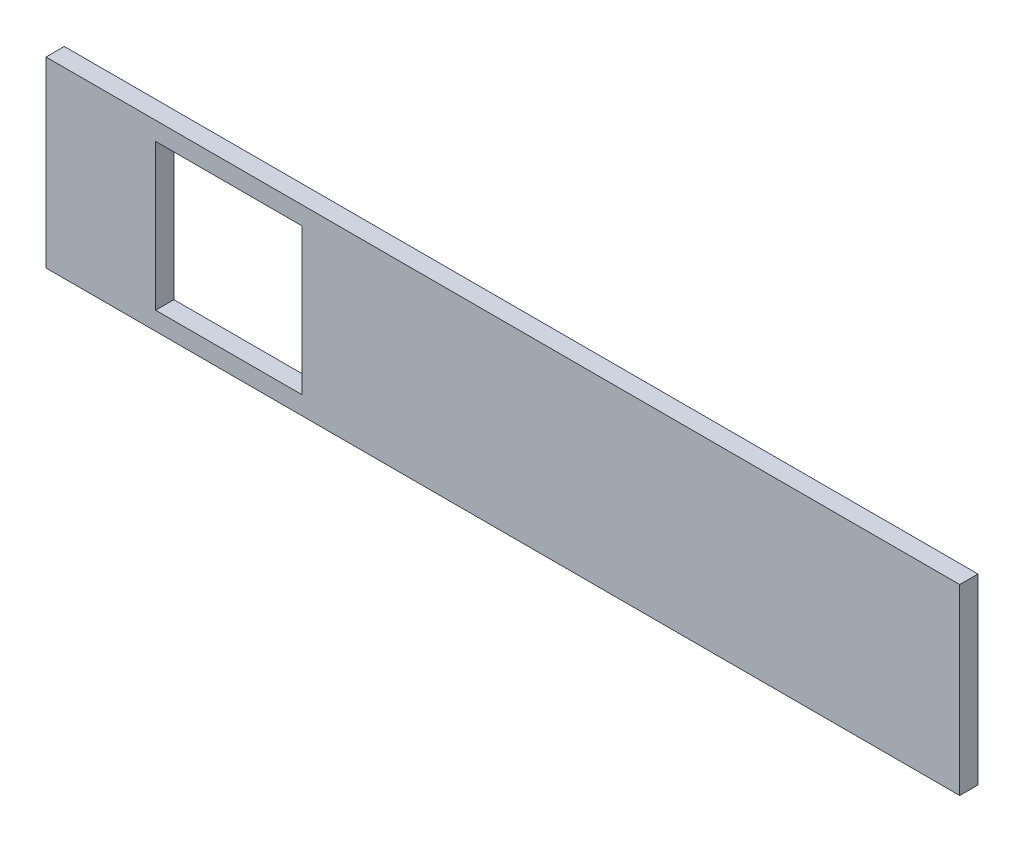
ISO-10303-21;
HEADER;
FILE_DESCRIPTION(('STEP AP214'),'2;1');
FILE_NAME('part.step','',(''),(''),'','','');
FILE_SCHEMA(('AUTOMOTIVE_DESIGN { 1 0 10303 214 1 1 1 1 }'));
ENDSEC;
DATA;
#1=APPLICATION_CONTEXT('core data for automotive mechanical design processes');
#2=APPLICATION_PROTOCOL_DEFINITION('international standard','automotive_design',2000,#1);
#3=PRODUCT_CONTEXT('',#1,'mechanical');
#4=PRODUCT('Part','Part','',(#3));
#5=PRODUCT_RELATED_PRODUCT_CATEGORY('part','',(#4));
#6=PRODUCT_DEFINITION_FORMATION('','',#4);
#7=PRODUCT_DEFINITION_CONTEXT('part definition',#1,'design');
#8=PRODUCT_DEFINITION('design','',#6,#7);
#9=PRODUCT_DEFINITION_SHAPE('','',#8);
#10=(LENGTH_UNIT() NAMED_UNIT(*) SI_UNIT(.MILLI.,.METRE.));
#11=(NAMED_UNIT(*) PLANE_ANGLE_UNIT() SI_UNIT($,.RADIAN.));
#12=(NAMED_UNIT(*) SI_UNIT($,.STERADIAN.) SOLID_ANGLE_UNIT());
#13=UNCERTAINTY_MEASURE_WITH_UNIT(LENGTH_MEASURE(1.E-05),#10,'distance_accuracy_value','');
#14=(GEOMETRIC_REPRESENTATION_CONTEXT(3) GLOBAL_UNCERTAINTY_ASSIGNED_CONTEXT((#13)) GLOBAL_UNIT_ASSIGNED_CONTEXT((#10,
#11,#12)) REPRESENTATION_CONTEXT('',''));
#15=CARTESIAN_POINT('',(0.,0.,0.));
#16=DIRECTION('',(0.,0.,1.));
#17=DIRECTION('',(1.,0.,0.));
#18=AXIS2_PLACEMENT_3D('',#15,#16,#17);
#19=CARTESIAN_POINT('',(0.,0.,10.));
#20=DIRECTION('',(0.,0.,1.));
#21=DIRECTION('',(1.,0.,0.));
#22=AXIS2_PLACEMENT_3D('',#19,#20,#21);
#23=PLANE('',#22);
#24=DIRECTION('',(0.,1.,0.));
#25=VECTOR('',#24,1.);
#26=CARTESIAN_POINT('',(0.,0.,10.));
#27=LINE('',#26,#25);
#28=CARTESIAN_POINT('',(0.,0.,10.));
#29=VERTEX_POINT('',#28);
#30=CARTESIAN_POINT('',(0.,100.,10.));
#31=VERTEX_POINT('',#30);
#32=EDGE_CURVE('E134',#29,#31,#27,.T.);
#33=ORIENTED_EDGE('',*,*,#32,.T.);
#34=DIRECTION('',(-1.,0.,0.));
#35=VECTOR('',#34,1.);
#36=CARTESIAN_POINT('',(0.,100.,10.));
#37=LINE('',#36,#35);
#38=CARTESIAN_POINT('',(-500.,99.9999999999999,10.));
#39=VERTEX_POINT('',#38);
#40=EDGE_CURVE('E137',#31,#39,#37,.T.);
#41=ORIENTED_EDGE('',*,*,#40,.T.);
#42=DIRECTION('',(0.,-1.,0.));
#43=VECTOR('',#42,1.);
#44=CARTESIAN_POINT('',(-500.,0.,10.));
#45=LINE('',#44,#43);
#46=CARTESIAN_POINT('',(-500.,0.,10.));
#47=VERTEX_POINT('',#46);
#48=EDGE_CURVE('E140',#39,#47,#45,.T.);
#49=ORIENTED_EDGE('',*,*,#48,.T.);
#50=DIRECTION('',(1.,0.,0.));
#51=VECTOR('',#50,1.);
#52=CARTESIAN_POINT('',(0.,0.,10.));
#53=LINE('',#52,#51);
#54=EDGE_CURVE('E142',#47,#29,#53,.T.);
#55=ORIENTED_EDGE('',*,*,#54,.T.);
#56=EDGE_LOOP('',(#33,#41,#49,#55));
#57=FACE_BOUND('',#56,.T.);
#58=DIRECTION('',(1.,0.,0.));
#59=VECTOR('',#58,1.);
#60=CARTESIAN_POINT('',(-440.,9.99999999999995,10.));
#61=LINE('',#60,#59);
#62=CARTESIAN_POINT('',(-440.,9.99999999999995,10.));
#63=VERTEX_POINT('',#62);
#64=CARTESIAN_POINT('',(-360.,9.99999999999995,10.));
#65=VERTEX_POINT('',#64);
#66=EDGE_CURVE('E106',#63,#65,#61,.T.);
#67=ORIENTED_EDGE('',*,*,#66,.F.);
#68=DIRECTION('',(0.,-1.,0.));
#69=VECTOR('',#68,1.);
#70=CARTESIAN_POINT('',(-440.,90.,10.));
#71=LINE('',#70,#69);
#72=CARTESIAN_POINT('',(-440.,90.,10.));
#73=VERTEX_POINT('',#72);
#74=EDGE_CURVE('E98',#73,#63,#71,.T.);
#75=ORIENTED_EDGE('',*,*,#74,.F.);
#76=DIRECTION('',(-1.,0.,0.));
#77=VECTOR('',#76,1.);
#78=CARTESIAN_POINT('',(-440.,90.,10.));
#79=LINE('',#78,#77);
#80=CARTESIAN_POINT('',(-360.,89.9999999999999,10.));
#81=VERTEX_POINT('',#80);
#82=EDGE_CURVE('E120',#81,#73,#79,.T.);
#83=ORIENTED_EDGE('',*,*,#82,.F.);
#84=DIRECTION('',(0.,1.,0.));
#85=VECTOR('',#84,1.);
#86=CARTESIAN_POINT('',(-360.,89.9999999999999,10.));
#87=LINE('',#86,#85);
#88=EDGE_CURVE('E118',#65,#81,#87,.T.);
#89=ORIENTED_EDGE('',*,*,#88,.F.);
#90=EDGE_LOOP('',(#67,#75,#83,#89));
#91=FACE_BOUND('',#90,.T.);
#92=ADVANCED_FACE('F33',(#57,#91),#23,.T.);
#93=CARTESIAN_POINT('',(0.,0.,0.));
#94=DIRECTION('',(0.,0.,1.));
#95=DIRECTION('',(1.,0.,0.));
#96=AXIS2_PLACEMENT_3D('',#93,#94,#95);
#97=PLANE('',#96);
#98=DIRECTION('',(0.,1.,0.));
#99=VECTOR('',#98,1.);
#100=CARTESIAN_POINT('',(0.,0.,0.));
#101=LINE('',#100,#99);
#102=CARTESIAN_POINT('',(0.,0.,0.));
#103=VERTEX_POINT('',#102);
#104=CARTESIAN_POINT('',(0.,100.,0.));
#105=VERTEX_POINT('',#104);
#106=EDGE_CURVE('E114',#103,#105,#101,.T.);
#107=ORIENTED_EDGE('',*,*,#106,.F.);
#108=DIRECTION('',(1.,0.,0.));
#109=VECTOR('',#108,1.);
#110=CARTESIAN_POINT('',(0.,0.,0.));
#111=LINE('',#110,#109);
#112=CARTESIAN_POINT('',(-500.,0.,0.));
#113=VERTEX_POINT('',#112);
#114=EDGE_CURVE('E138',#113,#103,#111,.T.);
#115=ORIENTED_EDGE('',*,*,#114,.F.);
#116=DIRECTION('',(0.,-1.,0.));
#117=VECTOR('',#116,1.);
#118=CARTESIAN_POINT('',(-500.,0.,0.));
#119=LINE('',#118,#117);
#120=CARTESIAN_POINT('',(-500.,99.9999999999999,0.));
#121=VERTEX_POINT('',#120);
#122=EDGE_CURVE('E149',#121,#113,#119,.T.);
#123=ORIENTED_EDGE('',*,*,#122,.F.);
#124=DIRECTION('',(-1.,0.,0.));
#125=VECTOR('',#124,1.);
#126=CARTESIAN_POINT('',(0.,100.,0.));
#127=LINE('',#126,#125);
#128=EDGE_CURVE('E147',#105,#121,#127,.T.);
#129=ORIENTED_EDGE('',*,*,#128,.F.);
#130=EDGE_LOOP('',(#107,#115,#123,#129));
#131=FACE_BOUND('',#130,.T.);
#132=DIRECTION('',(0.,-1.,0.));
#133=VECTOR('',#132,1.);
#134=CARTESIAN_POINT('',(-440.,90.,0.));
#135=LINE('',#134,#133);
#136=CARTESIAN_POINT('',(-440.,90.,0.));
#137=VERTEX_POINT('',#136);
#138=CARTESIAN_POINT('',(-440.,9.99999999999995,0.));
#139=VERTEX_POINT('',#138);
#140=EDGE_CURVE('E56',#137,#139,#135,.T.);
#141=ORIENTED_EDGE('',*,*,#140,.T.);
#142=DIRECTION('',(1.,0.,0.));
#143=VECTOR('',#142,1.);
#144=CARTESIAN_POINT('',(-440.,9.99999999999995,0.));
#145=LINE('',#144,#143);
#146=CARTESIAN_POINT('',(-360.,9.99999999999995,0.));
#147=VERTEX_POINT('',#146);
#148=EDGE_CURVE('E113',#139,#147,#145,.T.);
#149=ORIENTED_EDGE('',*,*,#148,.T.);
#150=DIRECTION('',(0.,1.,0.));
#151=VECTOR('',#150,1.);
#152=CARTESIAN_POINT('',(-360.,89.9999999999999,0.));
#153=LINE('',#152,#151);
#154=CARTESIAN_POINT('',(-360.,89.9999999999999,0.));
#155=VERTEX_POINT('',#154);
#156=EDGE_CURVE('E126',#147,#155,#153,.T.);
#157=ORIENTED_EDGE('',*,*,#156,.T.);
#158=DIRECTION('',(-1.,0.,0.));
#159=VECTOR('',#158,1.);
#160=CARTESIAN_POINT('',(-440.,90.,0.));
#161=LINE('',#160,#159);
#162=EDGE_CURVE('E107',#155,#137,#161,.T.);
#163=ORIENTED_EDGE('',*,*,#162,.T.);
#164=EDGE_LOOP('',(#141,#149,#157,#163));
#165=FACE_BOUND('',#164,.T.);
#166=ADVANCED_FACE('F167',(#131,#165),#97,.F.);
#167=CARTESIAN_POINT('',(0.,0.,10.));
#168=DIRECTION('',(-1.,0.,0.));
#169=DIRECTION('',(0.,-1.,0.));
#170=AXIS2_PLACEMENT_3D('',#167,#168,#169);
#171=PLANE('',#170);
#172=ORIENTED_EDGE('',*,*,#106,.T.);
#173=DIRECTION('',(0.,0.,-1.));
#174=VECTOR('',#173,1.);
#175=CARTESIAN_POINT('',(0.,100.,10.));
#176=LINE('',#175,#174);
#177=EDGE_CURVE('E11',#31,#105,#176,.T.);
#178=ORIENTED_EDGE('',*,*,#177,.F.);
#179=ORIENTED_EDGE('',*,*,#32,.F.);
#180=DIRECTION('',(0.,0.,-1.));
#181=VECTOR('',#180,1.);
#182=CARTESIAN_POINT('',(0.,0.,10.));
#183=LINE('',#182,#181);
#184=EDGE_CURVE('E144',#29,#103,#183,.T.);
#185=ORIENTED_EDGE('',*,*,#184,.T.);
#186=EDGE_LOOP('',(#172,#178,#179,#185));
#187=FACE_BOUND('',#186,.T.);
#188=ADVANCED_FACE('F35',(#187),#171,.F.);
#189=CARTESIAN_POINT('',(0.,100.,10.));
#190=DIRECTION('',(0.,-1.,0.));
#191=DIRECTION('',(1.,0.,0.));
#192=AXIS2_PLACEMENT_3D('',#189,#190,#191);
#193=PLANE('',#192);
#194=ORIENTED_EDGE('',*,*,#128,.T.);
#195=DIRECTION('',(0.,0.,-1.));
#196=VECTOR('',#195,1.);
#197=CARTESIAN_POINT('',(-500.,99.9999999999999,10.));
#198=LINE('',#197,#196);
#199=EDGE_CURVE('E41',#39,#121,#198,.T.);
#200=ORIENTED_EDGE('',*,*,#199,.F.);
#201=ORIENTED_EDGE('',*,*,#40,.F.);
#202=ORIENTED_EDGE('',*,*,#177,.T.);
#203=EDGE_LOOP('',(#194,#200,#201,#202));
#204=FACE_BOUND('',#203,.T.);
#205=ADVANCED_FACE('F177',(#204),#193,.F.);
#206=CARTESIAN_POINT('',(-500.,0.,10.));
#207=DIRECTION('',(1.,0.,0.));
#208=DIRECTION('',(0.,0.,-1.));
#209=AXIS2_PLACEMENT_3D('',#206,#207,#208);
#210=PLANE('',#209);
#211=ORIENTED_EDGE('',*,*,#122,.T.);
#212=DIRECTION('',(0.,0.,-1.));
#213=VECTOR('',#212,1.);
#214=CARTESIAN_POINT('',(-500.,0.,10.));
#215=LINE('',#214,#213);
#216=EDGE_CURVE('E154',#47,#113,#215,.T.);
#217=ORIENTED_EDGE('',*,*,#216,.F.);
#218=ORIENTED_EDGE('',*,*,#48,.F.);
#219=ORIENTED_EDGE('',*,*,#199,.T.);
#220=EDGE_LOOP('',(#211,#217,#218,#219));
#221=FACE_BOUND('',#220,.T.);
#222=ADVANCED_FACE('F161',(#221),#210,.F.);
#223=CARTESIAN_POINT('',(0.,0.,10.));
#224=DIRECTION('',(0.,1.,0.));
#225=DIRECTION('',(-1.,0.,0.));
#226=AXIS2_PLACEMENT_3D('',#223,#224,#225);
#227=PLANE('',#226);
#228=ORIENTED_EDGE('',*,*,#114,.T.);
#229=ORIENTED_EDGE('',*,*,#184,.F.);
#230=ORIENTED_EDGE('',*,*,#54,.F.);
#231=ORIENTED_EDGE('',*,*,#216,.T.);
#232=EDGE_LOOP('',(#228,#229,#230,#231));
#233=FACE_BOUND('',#232,.T.);
#234=ADVANCED_FACE('F171',(#233),#227,.F.);
#235=CARTESIAN_POINT('',(-440.,90.,10.));
#236=DIRECTION('',(1.,0.,0.));
#237=DIRECTION('',(0.,0.,-1.));
#238=AXIS2_PLACEMENT_3D('',#235,#236,#237);
#239=PLANE('',#238);
#240=ORIENTED_EDGE('',*,*,#140,.F.);
#241=DIRECTION('',(0.,0.,-1.));
#242=VECTOR('',#241,1.);
#243=CARTESIAN_POINT('',(-440.,90.,10.));
#244=LINE('',#243,#242);
#245=EDGE_CURVE('E102',#73,#137,#244,.T.);
#246=ORIENTED_EDGE('',*,*,#245,.F.);
#247=ORIENTED_EDGE('',*,*,#74,.T.);
#248=DIRECTION('',(0.,0.,-1.));
#249=VECTOR('',#248,1.);
#250=CARTESIAN_POINT('',(-440.,9.99999999999995,10.));
#251=LINE('',#250,#249);
#252=EDGE_CURVE('E101',#63,#139,#251,.T.);
#253=ORIENTED_EDGE('',*,*,#252,.T.);
#254=EDGE_LOOP('',(#240,#246,#247,#253));
#255=FACE_BOUND('',#254,.T.);
#256=ADVANCED_FACE('F100',(#255),#239,.T.);
#257=CARTESIAN_POINT('',(-440.,9.99999999999995,10.));
#258=DIRECTION('',(0.,1.,0.));
#259=DIRECTION('',(0.,0.,1.));
#260=AXIS2_PLACEMENT_3D('',#257,#258,#259);
#261=PLANE('',#260);
#262=ORIENTED_EDGE('',*,*,#148,.F.);
#263=ORIENTED_EDGE('',*,*,#252,.F.);
#264=ORIENTED_EDGE('',*,*,#66,.T.);
#265=DIRECTION('',(0.,0.,-1.));
#266=VECTOR('',#265,1.);
#267=CARTESIAN_POINT('',(-360.,9.99999999999995,10.));
#268=LINE('',#267,#266);
#269=EDGE_CURVE('E115',#65,#147,#268,.T.);
#270=ORIENTED_EDGE('',*,*,#269,.T.);
#271=EDGE_LOOP('',(#262,#263,#264,#270));
#272=FACE_BOUND('',#271,.T.);
#273=ADVANCED_FACE('F110',(#272),#261,.T.);
#274=CARTESIAN_POINT('',(-360.,89.9999999999999,10.));
#275=DIRECTION('',(-1.,0.,0.));
#276=DIRECTION('',(0.,0.,1.));
#277=AXIS2_PLACEMENT_3D('',#274,#275,#276);
#278=PLANE('',#277);
#279=ORIENTED_EDGE('',*,*,#156,.F.);
#280=ORIENTED_EDGE('',*,*,#269,.F.);
#281=ORIENTED_EDGE('',*,*,#88,.T.);
#282=DIRECTION('',(0.,0.,-1.));
#283=VECTOR('',#282,1.);
#284=CARTESIAN_POINT('',(-360.,89.9999999999999,10.));
#285=LINE('',#284,#283);
#286=EDGE_CURVE('E48',#81,#155,#285,.T.);
#287=ORIENTED_EDGE('',*,*,#286,.T.);
#288=EDGE_LOOP('',(#279,#280,#281,#287));
#289=FACE_BOUND('',#288,.T.);
#290=ADVANCED_FACE('F200',(#289),#278,.T.);
#291=CARTESIAN_POINT('',(-440.,90.,10.));
#292=DIRECTION('',(0.,-1.,0.));
#293=DIRECTION('',(1.,0.,0.));
#294=AXIS2_PLACEMENT_3D('',#291,#292,#293);
#295=PLANE('',#294);
#296=ORIENTED_EDGE('',*,*,#162,.F.);
#297=ORIENTED_EDGE('',*,*,#286,.F.);
#298=ORIENTED_EDGE('',*,*,#82,.T.);
#299=ORIENTED_EDGE('',*,*,#245,.T.);
#300=EDGE_LOOP('',(#296,#297,#298,#299));
#301=FACE_BOUND('',#300,.T.);
#302=ADVANCED_FACE('F204',(#301),#295,.T.);
#303=CLOSED_SHELL('',(#92,#166,#188,#205,#222,#234,#256,#273,#290,#302));
#304=MANIFOLD_SOLID_BREP('B2',#303);
#305=ADVANCED_BREP_SHAPE_REPRESENTATION('',(#18,#304),#14);
#306=SHAPE_DEFINITION_REPRESENTATION(#9,#305);
ENDSEC;
END-ISO-10303-21;
